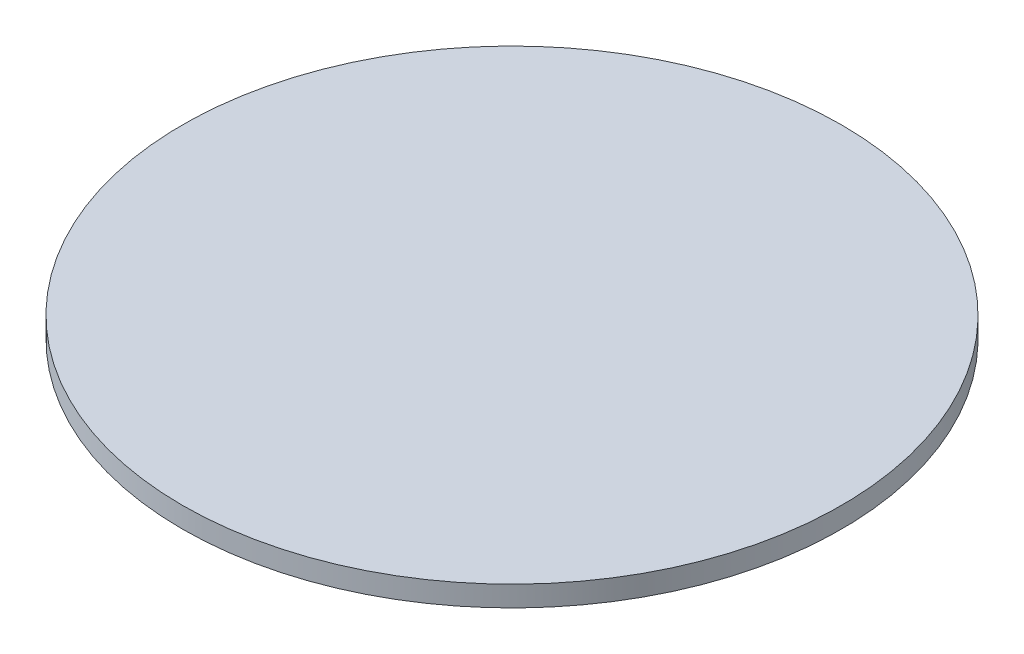
ISO-10303-21;
HEADER;
FILE_DESCRIPTION(('STEP AP214'),'2;1');
FILE_NAME('part.step','',(''),(''),'','','');
FILE_SCHEMA(('AUTOMOTIVE_DESIGN { 1 0 10303 214 1 1 1 1 }'));
ENDSEC;
DATA;
#1=APPLICATION_CONTEXT('core data for automotive mechanical design processes');
#2=APPLICATION_PROTOCOL_DEFINITION('international standard','automotive_design',2000,#1);
#3=PRODUCT_CONTEXT('',#1,'mechanical');
#4=PRODUCT('Part','Part','',(#3));
#5=PRODUCT_RELATED_PRODUCT_CATEGORY('part','',(#4));
#6=PRODUCT_DEFINITION_FORMATION('','',#4);
#7=PRODUCT_DEFINITION_CONTEXT('part definition',#1,'design');
#8=PRODUCT_DEFINITION('design','',#6,#7);
#9=PRODUCT_DEFINITION_SHAPE('','',#8);
#10=(LENGTH_UNIT() NAMED_UNIT(*) SI_UNIT(.MILLI.,.METRE.));
#11=(NAMED_UNIT(*) PLANE_ANGLE_UNIT() SI_UNIT($,.RADIAN.));
#12=(NAMED_UNIT(*) SI_UNIT($,.STERADIAN.) SOLID_ANGLE_UNIT());
#13=UNCERTAINTY_MEASURE_WITH_UNIT(LENGTH_MEASURE(1.E-05),#10,'distance_accuracy_value','');
#14=(GEOMETRIC_REPRESENTATION_CONTEXT(3) GLOBAL_UNCERTAINTY_ASSIGNED_CONTEXT((#13)) GLOBAL_UNIT_ASSIGNED_CONTEXT((#10,
#11,#12)) REPRESENTATION_CONTEXT('',''));
#15=CARTESIAN_POINT('',(0.,0.,0.));
#16=DIRECTION('',(0.,0.,1.));
#17=DIRECTION('',(1.,0.,0.));
#18=AXIS2_PLACEMENT_3D('',#15,#16,#17);
#19=CARTESIAN_POINT('',(0.,3.175,0.));
#20=DIRECTION('',(0.,-1.,0.));
#21=DIRECTION('',(0.,0.,-1.));
#22=AXIS2_PLACEMENT_3D('',#19,#20,#21);
#23=CYLINDRICAL_SURFACE('',#22,50.8);
#24=CARTESIAN_POINT('',(0.,3.175,0.));
#25=DIRECTION('',(0.,1.,0.));
#26=DIRECTION('',(0.,0.,1.));
#27=AXIS2_PLACEMENT_3D('',#24,#25,#26);
#28=CIRCLE('',#27,50.8);
#29=CARTESIAN_POINT('',(0.,3.175,50.8));
#30=VERTEX_POINT('',#29);
#31=EDGE_CURVE('E10',#30,#30,#28,.T.);
#32=ORIENTED_EDGE('',*,*,#31,.F.);
#33=EDGE_LOOP('',(#32));
#34=FACE_BOUND('',#33,.T.);
#35=CARTESIAN_POINT('',(0.,0.,0.));
#36=DIRECTION('',(0.,1.,0.));
#37=DIRECTION('',(0.,0.,1.));
#38=AXIS2_PLACEMENT_3D('',#35,#36,#37);
#39=CIRCLE('',#38,50.8);
#40=CARTESIAN_POINT('',(0.,0.,50.8));
#41=VERTEX_POINT('',#40);
#42=EDGE_CURVE('E34',#41,#41,#39,.T.);
#43=ORIENTED_EDGE('',*,*,#42,.T.);
#44=EDGE_LOOP('',(#43));
#45=FACE_BOUND('',#44,.T.);
#46=ADVANCED_FACE('F31',(#34,#45),#23,.T.);
#47=CARTESIAN_POINT('',(0.,3.175,0.));
#48=DIRECTION('',(0.,1.,0.));
#49=DIRECTION('',(0.,0.,1.));
#50=AXIS2_PLACEMENT_3D('',#47,#48,#49);
#51=PLANE('',#50);
#52=ORIENTED_EDGE('',*,*,#31,.T.);
#53=EDGE_LOOP('',(#52));
#54=FACE_BOUND('',#53,.T.);
#55=ADVANCED_FACE('F46',(#54),#51,.T.);
#56=CARTESIAN_POINT('',(0.,0.,0.));
#57=DIRECTION('',(0.,1.,0.));
#58=DIRECTION('',(0.,0.,1.));
#59=AXIS2_PLACEMENT_3D('',#56,#57,#58);
#60=PLANE('',#59);
#61=ORIENTED_EDGE('',*,*,#42,.F.);
#62=EDGE_LOOP('',(#61));
#63=FACE_BOUND('',#62,.T.);
#64=ADVANCED_FACE('F44',(#63),#60,.F.);
#65=CLOSED_SHELL('',(#46,#55,#64));
#66=MANIFOLD_SOLID_BREP('B2',#65);
#67=ADVANCED_BREP_SHAPE_REPRESENTATION('',(#18,#66),#14);
#68=SHAPE_DEFINITION_REPRESENTATION(#9,#67);
ENDSEC;
END-ISO-10303-21;
